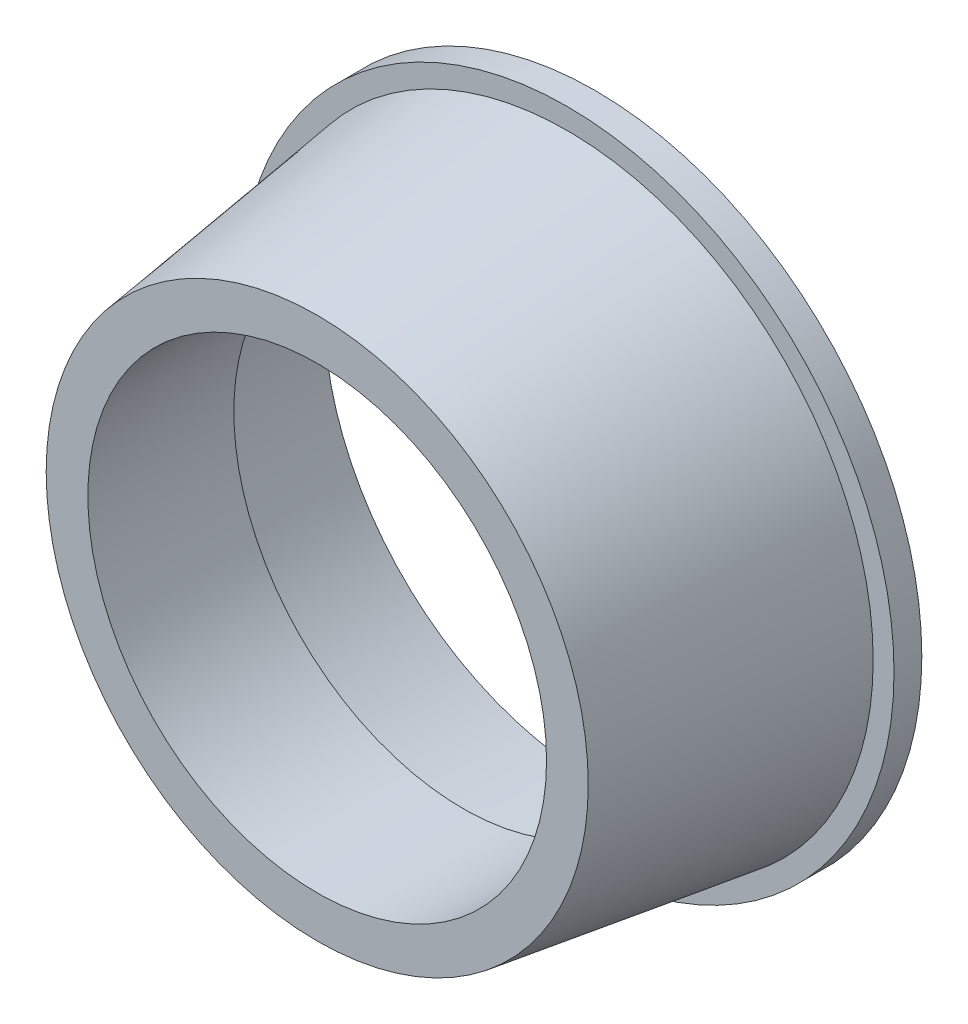
ISO-10303-21;
HEADER;
FILE_DESCRIPTION(('STEP AP214'),'2;1');
FILE_NAME('part.step','',(''),(''),'','','');
FILE_SCHEMA(('AUTOMOTIVE_DESIGN { 1 0 10303 214 1 1 1 1 }'));
ENDSEC;
DATA;
#1=APPLICATION_CONTEXT('core data for automotive mechanical design processes');
#2=APPLICATION_PROTOCOL_DEFINITION('international standard','automotive_design',2000,#1);
#3=PRODUCT_CONTEXT('',#1,'mechanical');
#4=PRODUCT('Part','Part','',(#3));
#5=PRODUCT_RELATED_PRODUCT_CATEGORY('part','',(#4));
#6=PRODUCT_DEFINITION_FORMATION('','',#4);
#7=PRODUCT_DEFINITION_CONTEXT('part definition',#1,'design');
#8=PRODUCT_DEFINITION('design','',#6,#7);
#9=PRODUCT_DEFINITION_SHAPE('','',#8);
#10=(LENGTH_UNIT() NAMED_UNIT(*) SI_UNIT(.MILLI.,.METRE.));
#11=(NAMED_UNIT(*) PLANE_ANGLE_UNIT() SI_UNIT($,.RADIAN.));
#12=(NAMED_UNIT(*) SI_UNIT($,.STERADIAN.) SOLID_ANGLE_UNIT());
#13=UNCERTAINTY_MEASURE_WITH_UNIT(LENGTH_MEASURE(1.E-05),#10,'distance_accuracy_value','');
#14=(GEOMETRIC_REPRESENTATION_CONTEXT(3) GLOBAL_UNCERTAINTY_ASSIGNED_CONTEXT((#13)) GLOBAL_UNIT_ASSIGNED_CONTEXT((#10,
#11,#12)) REPRESENTATION_CONTEXT('',''));
#15=CARTESIAN_POINT('',(0.,0.,0.));
#16=DIRECTION('',(0.,0.,1.));
#17=DIRECTION('',(1.,0.,0.));
#18=AXIS2_PLACEMENT_3D('',#15,#16,#17);
#19=CARTESIAN_POINT('',(-23.5,0.,0.));
#20=DIRECTION('',(0.,0.,1.));
#21=DIRECTION('',(1.,0.,0.));
#22=AXIS2_PLACEMENT_3D('',#19,#20,#21);
#23=PLANE('',#22);
#24=CARTESIAN_POINT('',(0.,0.,0.));
#25=DIRECTION('',(0.,0.,1.));
#26=DIRECTION('',(1.,0.,0.));
#27=AXIS2_PLACEMENT_3D('',#24,#25,#26);
#28=CIRCLE('',#27,23.5);
#29=CARTESIAN_POINT('',(23.5,0.,0.));
#30=VERTEX_POINT('',#29);
#31=EDGE_CURVE('E65',#30,#30,#28,.T.);
#32=ORIENTED_EDGE('',*,*,#31,.F.);
#33=EDGE_LOOP('',(#32));
#34=FACE_BOUND('',#33,.T.);
#35=CARTESIAN_POINT('',(0.,0.,0.));
#36=DIRECTION('',(0.,0.,1.));
#37=DIRECTION('',(1.,0.,0.));
#38=AXIS2_PLACEMENT_3D('',#35,#36,#37);
#39=CIRCLE('',#38,19.5);
#40=CARTESIAN_POINT('',(19.5,0.,0.));
#41=VERTEX_POINT('',#40);
#42=EDGE_CURVE('E10',#41,#41,#39,.T.);
#43=ORIENTED_EDGE('',*,*,#42,.T.);
#44=EDGE_LOOP('',(#43));
#45=FACE_BOUND('',#44,.T.);
#46=ADVANCED_FACE('F37',(#34,#45),#23,.F.);
#47=CARTESIAN_POINT('',(0.,0.,8.));
#48=DIRECTION('',(0.,0.,-1.));
#49=DIRECTION('',(-1.,0.,0.));
#50=AXIS2_PLACEMENT_3D('',#47,#48,#49);
#51=CONICAL_SURFACE('',#50,19.25,0.0312398334302679);
#52=ORIENTED_EDGE('',*,*,#42,.F.);
#53=EDGE_LOOP('',(#52));
#54=FACE_BOUND('',#53,.T.);
#55=CARTESIAN_POINT('',(0.,0.,8.));
#56=DIRECTION('',(0.,0.,1.));
#57=DIRECTION('',(1.,0.,0.));
#58=AXIS2_PLACEMENT_3D('',#55,#56,#57);
#59=CIRCLE('',#58,19.25);
#60=CARTESIAN_POINT('',(19.25,0.,8.));
#61=VERTEX_POINT('',#60);
#62=EDGE_CURVE('E43',#61,#61,#59,.T.);
#63=ORIENTED_EDGE('',*,*,#62,.T.);
#64=EDGE_LOOP('',(#63));
#65=FACE_BOUND('',#64,.T.);
#66=ADVANCED_FACE('F72',(#54,#65),#51,.F.);
#67=CARTESIAN_POINT('',(0.,0.,9.5));
#68=DIRECTION('',(0.,0.,-1.));
#69=DIRECTION('',(-1.,0.,0.));
#70=AXIS2_PLACEMENT_3D('',#67,#68,#69);
#71=CONICAL_SURFACE('',#70,16.5,1.07144960511477);
#72=ORIENTED_EDGE('',*,*,#62,.F.);
#73=EDGE_LOOP('',(#72));
#74=FACE_BOUND('',#73,.T.);
#75=CARTESIAN_POINT('',(0.,0.,9.5));
#76=DIRECTION('',(0.,0.,1.));
#77=DIRECTION('',(1.,0.,0.));
#78=AXIS2_PLACEMENT_3D('',#75,#76,#77);
#79=CIRCLE('',#78,16.5);
#80=CARTESIAN_POINT('',(16.5,0.,9.5));
#81=VERTEX_POINT('',#80);
#82=EDGE_CURVE('E47',#81,#81,#79,.T.);
#83=ORIENTED_EDGE('',*,*,#82,.T.);
#84=EDGE_LOOP('',(#83));
#85=FACE_BOUND('',#84,.T.);
#86=ADVANCED_FACE('F76',(#74,#85),#71,.F.);
#87=CARTESIAN_POINT('',(0.,0.,20.));
#88=DIRECTION('',(0.,0.,1.));
#89=DIRECTION('',(1.,0.,0.));
#90=AXIS2_PLACEMENT_3D('',#87,#88,#89);
#91=CYLINDRICAL_SURFACE('',#90,16.5);
#92=ORIENTED_EDGE('',*,*,#82,.F.);
#93=EDGE_LOOP('',(#92));
#94=FACE_BOUND('',#93,.T.);
#95=CARTESIAN_POINT('',(0.,0.,20.));
#96=DIRECTION('',(0.,0.,1.));
#97=DIRECTION('',(1.,0.,0.));
#98=AXIS2_PLACEMENT_3D('',#95,#96,#97);
#99=CIRCLE('',#98,16.5);
#100=CARTESIAN_POINT('',(16.5,0.,20.));
#101=VERTEX_POINT('',#100);
#102=EDGE_CURVE('E51',#101,#101,#99,.T.);
#103=ORIENTED_EDGE('',*,*,#102,.T.);
#104=EDGE_LOOP('',(#103));
#105=FACE_BOUND('',#104,.T.);
#106=ADVANCED_FACE('F81',(#94,#105),#91,.F.);
#107=CARTESIAN_POINT('',(-19.5,0.,20.));
#108=DIRECTION('',(0.,0.,-1.));
#109=DIRECTION('',(-1.,0.,0.));
#110=AXIS2_PLACEMENT_3D('',#107,#108,#109);
#111=PLANE('',#110);
#112=ORIENTED_EDGE('',*,*,#102,.F.);
#113=EDGE_LOOP('',(#112));
#114=FACE_BOUND('',#113,.T.);
#115=CARTESIAN_POINT('',(0.,0.,20.));
#116=DIRECTION('',(0.,0.,1.));
#117=DIRECTION('',(1.,0.,0.));
#118=AXIS2_PLACEMENT_3D('',#115,#116,#117);
#119=CIRCLE('',#118,19.5);
#120=CARTESIAN_POINT('',(19.5,0.,20.));
#121=VERTEX_POINT('',#120);
#122=EDGE_CURVE('E56',#121,#121,#119,.T.);
#123=ORIENTED_EDGE('',*,*,#122,.T.);
#124=EDGE_LOOP('',(#123));
#125=FACE_BOUND('',#124,.T.);
#126=ADVANCED_FACE('F87',(#114,#125),#111,.F.);
#127=CARTESIAN_POINT('',(0.,0.,2.));
#128=DIRECTION('',(0.,0.,-1.));
#129=DIRECTION('',(-1.,0.,0.));
#130=AXIS2_PLACEMENT_3D('',#127,#128,#129);
#131=CONICAL_SURFACE('',#130,22.,0.138006023657519);
#132=ORIENTED_EDGE('',*,*,#122,.F.);
#133=EDGE_LOOP('',(#132));
#134=FACE_BOUND('',#133,.T.);
#135=CARTESIAN_POINT('',(0.,0.,2.));
#136=DIRECTION('',(0.,0.,1.));
#137=DIRECTION('',(1.,0.,0.));
#138=AXIS2_PLACEMENT_3D('',#135,#136,#137);
#139=CIRCLE('',#138,22.);
#140=CARTESIAN_POINT('',(22.,0.,2.));
#141=VERTEX_POINT('',#140);
#142=EDGE_CURVE('E59',#141,#141,#139,.T.);
#143=ORIENTED_EDGE('',*,*,#142,.T.);
#144=EDGE_LOOP('',(#143));
#145=FACE_BOUND('',#144,.T.);
#146=ADVANCED_FACE('F91',(#134,#145),#131,.T.);
#147=CARTESIAN_POINT('',(-23.5,0.,2.));
#148=DIRECTION('',(0.,0.,-1.));
#149=DIRECTION('',(-1.,0.,0.));
#150=AXIS2_PLACEMENT_3D('',#147,#148,#149);
#151=PLANE('',#150);
#152=ORIENTED_EDGE('',*,*,#142,.F.);
#153=EDGE_LOOP('',(#152));
#154=FACE_BOUND('',#153,.T.);
#155=CARTESIAN_POINT('',(0.,0.,2.));
#156=DIRECTION('',(0.,0.,1.));
#157=DIRECTION('',(1.,0.,0.));
#158=AXIS2_PLACEMENT_3D('',#155,#156,#157);
#159=CIRCLE('',#158,23.5);
#160=CARTESIAN_POINT('',(23.5,0.,2.));
#161=VERTEX_POINT('',#160);
#162=EDGE_CURVE('E62',#161,#161,#159,.T.);
#163=ORIENTED_EDGE('',*,*,#162,.T.);
#164=EDGE_LOOP('',(#163));
#165=FACE_BOUND('',#164,.T.);
#166=ADVANCED_FACE('F95',(#154,#165),#151,.F.);
#167=CARTESIAN_POINT('',(0.,0.,20.));
#168=DIRECTION('',(0.,0.,1.));
#169=DIRECTION('',(1.,0.,0.));
#170=AXIS2_PLACEMENT_3D('',#167,#168,#169);
#171=CYLINDRICAL_SURFACE('',#170,23.5);
#172=ORIENTED_EDGE('',*,*,#162,.F.);
#173=EDGE_LOOP('',(#172));
#174=FACE_BOUND('',#173,.T.);
#175=ORIENTED_EDGE('',*,*,#31,.T.);
#176=EDGE_LOOP('',(#175));
#177=FACE_BOUND('',#176,.T.);
#178=ADVANCED_FACE('F69',(#174,#177),#171,.T.);
#179=CLOSED_SHELL('',(#46,#66,#86,#106,#126,#146,#166,#178));
#180=MANIFOLD_SOLID_BREP('B2',#179);
#181=ADVANCED_BREP_SHAPE_REPRESENTATION('',(#18,#180),#14);
#182=SHAPE_DEFINITION_REPRESENTATION(#9,#181);
ENDSEC;
END-ISO-10303-21;
